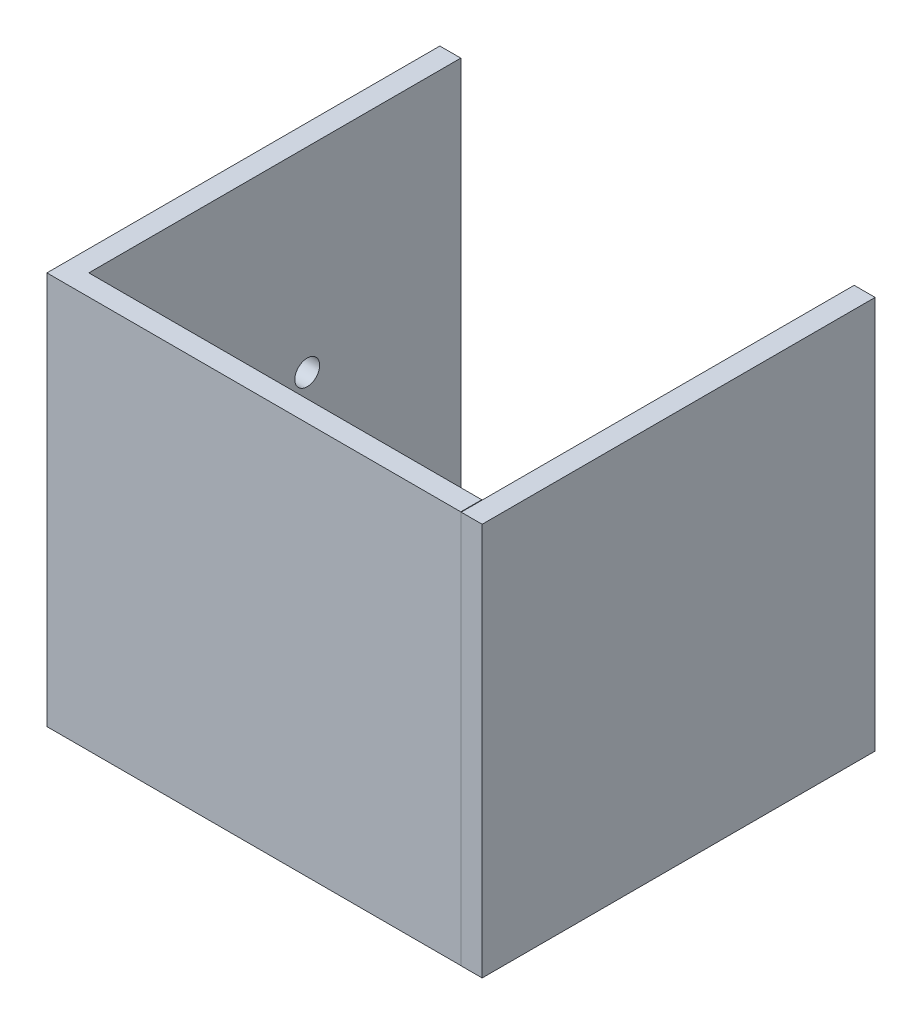
ISO-10303-21;
HEADER;
FILE_DESCRIPTION(('STEP AP214'),'2;1');
FILE_NAME('part.step','',(''),(''),'','','');
FILE_SCHEMA(('AUTOMOTIVE_DESIGN { 1 0 10303 214 1 1 1 1 }'));
ENDSEC;
DATA;
#1=APPLICATION_CONTEXT('core data for automotive mechanical design processes');
#2=APPLICATION_PROTOCOL_DEFINITION('international standard','automotive_design',2000,#1);
#3=PRODUCT_CONTEXT('',#1,'mechanical');
#4=PRODUCT('Part','Part','',(#3));
#5=PRODUCT_RELATED_PRODUCT_CATEGORY('part','',(#4));
#6=PRODUCT_DEFINITION_FORMATION('','',#4);
#7=PRODUCT_DEFINITION_CONTEXT('part definition',#1,'design');
#8=PRODUCT_DEFINITION('design','',#6,#7);
#9=PRODUCT_DEFINITION_SHAPE('','',#8);
#10=(LENGTH_UNIT() NAMED_UNIT(*) SI_UNIT(.MILLI.,.METRE.));
#11=(NAMED_UNIT(*) PLANE_ANGLE_UNIT() SI_UNIT($,.RADIAN.));
#12=(NAMED_UNIT(*) SI_UNIT($,.STERADIAN.) SOLID_ANGLE_UNIT());
#13=UNCERTAINTY_MEASURE_WITH_UNIT(LENGTH_MEASURE(1.E-05),#10,'distance_accuracy_value','');
#14=(GEOMETRIC_REPRESENTATION_CONTEXT(3) GLOBAL_UNCERTAINTY_ASSIGNED_CONTEXT((#13)) GLOBAL_UNIT_ASSIGNED_CONTEXT((#10,
#11,#12)) REPRESENTATION_CONTEXT('',''));
#15=CARTESIAN_POINT('',(0.,0.,0.));
#16=DIRECTION('',(0.,0.,1.));
#17=DIRECTION('',(1.,0.,0.));
#18=AXIS2_PLACEMENT_3D('',#15,#16,#17);
#19=CARTESIAN_POINT('',(75.,75.,8.));
#20=DIRECTION('',(-1.,0.,0.));
#21=DIRECTION('',(0.,-1.,0.));
#22=AXIS2_PLACEMENT_3D('',#19,#20,#21);
#23=PLANE('',#22);
#24=DIRECTION('',(0.,-1.,0.));
#25=VECTOR('',#24,1.);
#26=CARTESIAN_POINT('',(75.,74.8173068671335,7.85028232579545));
#27=LINE('',#26,#25);
#28=CARTESIAN_POINT('',(75.,74.8173068671335,7.85028232579545));
#29=VERTEX_POINT('',#28);
#30=CARTESIAN_POINT('',(75.,-75.,7.85028232579544));
#31=VERTEX_POINT('',#30);
#32=EDGE_CURVE('E173',#29,#31,#27,.T.);
#33=ORIENTED_EDGE('',*,*,#32,.F.);
#34=DIRECTION('',(0.,0.,1.));
#35=VECTOR('',#34,1.);
#36=CARTESIAN_POINT('',(75.,74.8173068671335,7.85028232579545));
#37=LINE('',#36,#35);
#38=CARTESIAN_POINT('',(75.,74.8173068671335,0.));
#39=VERTEX_POINT('',#38);
#40=EDGE_CURVE('E11',#39,#29,#37,.T.);
#41=ORIENTED_EDGE('',*,*,#40,.F.);
#42=DIRECTION('',(0.,1.,0.));
#43=VECTOR('',#42,1.);
#44=CARTESIAN_POINT('',(75.,75.,0.));
#45=LINE('',#44,#43);
#46=CARTESIAN_POINT('',(75.,75.,0.));
#47=VERTEX_POINT('',#46);
#48=EDGE_CURVE('E192',#39,#47,#45,.T.);
#49=ORIENTED_EDGE('',*,*,#48,.T.);
#50=DIRECTION('',(0.,0.,-1.));
#51=VECTOR('',#50,1.);
#52=CARTESIAN_POINT('',(75.,75.,8.));
#53=LINE('',#52,#51);
#54=CARTESIAN_POINT('',(75.,75.,8.));
#55=VERTEX_POINT('',#54);
#56=EDGE_CURVE('E37',#55,#47,#53,.T.);
#57=ORIENTED_EDGE('',*,*,#56,.F.);
#58=DIRECTION('',(0.,1.,0.));
#59=VECTOR('',#58,1.);
#60=CARTESIAN_POINT('',(75.,75.,8.));
#61=LINE('',#60,#59);
#62=CARTESIAN_POINT('',(75.,-75.,8.));
#63=VERTEX_POINT('',#62);
#64=EDGE_CURVE('E123',#63,#55,#61,.T.);
#65=ORIENTED_EDGE('',*,*,#64,.F.);
#66=DIRECTION('',(0.,0.,-1.));
#67=VECTOR('',#66,1.);
#68=CARTESIAN_POINT('',(75.,-75.,8.));
#69=LINE('',#68,#67);
#70=EDGE_CURVE('E204',#63,#31,#69,.T.);
#71=ORIENTED_EDGE('',*,*,#70,.T.);
#72=EDGE_LOOP('',(#33,#41,#49,#57,#65,#71));
#73=FACE_BOUND('',#72,.T.);
#74=ADVANCED_FACE('F34',(#73),#23,.F.);
#75=CARTESIAN_POINT('',(-75.,75.,8.));
#76=DIRECTION('',(0.,-1.,0.));
#77=DIRECTION('',(0.,0.,-1.));
#78=AXIS2_PLACEMENT_3D('',#75,#76,#77);
#79=PLANE('',#78);
#80=DIRECTION('',(-1.,0.,0.));
#81=VECTOR('',#80,1.);
#82=CARTESIAN_POINT('',(-75.,75.,0.));
#83=LINE('',#82,#81);
#84=CARTESIAN_POINT('',(-75.,75.,0.));
#85=VERTEX_POINT('',#84);
#86=EDGE_CURVE('E199',#47,#85,#83,.T.);
#87=ORIENTED_EDGE('',*,*,#86,.T.);
#88=DIRECTION('',(0.,0.,-1.));
#89=VECTOR('',#88,1.);
#90=CARTESIAN_POINT('',(-75.,75.,8.));
#91=LINE('',#90,#89);
#92=CARTESIAN_POINT('',(-75.,75.,-142.));
#93=VERTEX_POINT('',#92);
#94=EDGE_CURVE('E155',#85,#93,#91,.T.);
#95=ORIENTED_EDGE('',*,*,#94,.T.);
#96=DIRECTION('',(1.,0.,0.));
#97=VECTOR('',#96,1.);
#98=CARTESIAN_POINT('',(-83.,75.,-142.));
#99=LINE('',#98,#97);
#100=CARTESIAN_POINT('',(-83.,75.,-142.));
#101=VERTEX_POINT('',#100);
#102=EDGE_CURVE('E133',#101,#93,#99,.T.);
#103=ORIENTED_EDGE('',*,*,#102,.F.);
#104=DIRECTION('',(0.,0.,-1.));
#105=VECTOR('',#104,1.);
#106=CARTESIAN_POINT('',(-83.,75.,8.));
#107=LINE('',#106,#105);
#108=CARTESIAN_POINT('',(-83.,75.,8.));
#109=VERTEX_POINT('',#108);
#110=EDGE_CURVE('E130',#109,#101,#107,.T.);
#111=ORIENTED_EDGE('',*,*,#110,.F.);
#112=DIRECTION('',(-1.,0.,0.));
#113=VECTOR('',#112,1.);
#114=CARTESIAN_POINT('',(-75.,75.,8.));
#115=LINE('',#114,#113);
#116=EDGE_CURVE('E117',#55,#109,#115,.T.);
#117=ORIENTED_EDGE('',*,*,#116,.F.);
#118=ORIENTED_EDGE('',*,*,#56,.T.);
#119=EDGE_LOOP('',(#87,#95,#103,#111,#117,#118));
#120=FACE_BOUND('',#119,.T.);
#121=ADVANCED_FACE('F131',(#120),#79,.F.);
#122=CARTESIAN_POINT('',(-75.,-75.,8.));
#123=DIRECTION('',(0.,1.,0.));
#124=DIRECTION('',(0.,0.,1.));
#125=AXIS2_PLACEMENT_3D('',#122,#123,#124);
#126=PLANE('',#125);
#127=DIRECTION('',(1.,0.,0.));
#128=VECTOR('',#127,1.);
#129=CARTESIAN_POINT('',(-75.,-75.,0.));
#130=LINE('',#129,#128);
#131=CARTESIAN_POINT('',(-75.,-75.,0.));
#132=VERTEX_POINT('',#131);
#133=CARTESIAN_POINT('',(75.,-75.,0.));
#134=VERTEX_POINT('',#133);
#135=EDGE_CURVE('E193',#132,#134,#130,.T.);
#136=ORIENTED_EDGE('',*,*,#135,.T.);
#137=EDGE_CURVE('E50',#31,#134,#69,.T.);
#138=ORIENTED_EDGE('',*,*,#137,.F.);
#139=ORIENTED_EDGE('',*,*,#70,.F.);
#140=DIRECTION('',(1.,0.,0.));
#141=VECTOR('',#140,1.);
#142=CARTESIAN_POINT('',(-75.,-75.,8.));
#143=LINE('',#142,#141);
#144=CARTESIAN_POINT('',(-83.,-75.,8.00000000000002));
#145=VERTEX_POINT('',#144);
#146=EDGE_CURVE('E127',#145,#63,#143,.T.);
#147=ORIENTED_EDGE('',*,*,#146,.F.);
#148=DIRECTION('',(0.,0.,1.));
#149=VECTOR('',#148,1.);
#150=CARTESIAN_POINT('',(-83.,-75.,8.00000000000002));
#151=LINE('',#150,#149);
#152=CARTESIAN_POINT('',(-83.,-75.,-142.));
#153=VERTEX_POINT('',#152);
#154=EDGE_CURVE('E142',#153,#145,#151,.T.);
#155=ORIENTED_EDGE('',*,*,#154,.F.);
#156=DIRECTION('',(1.,0.,0.));
#157=VECTOR('',#156,1.);
#158=CARTESIAN_POINT('',(-83.,-75.,-142.));
#159=LINE('',#158,#157);
#160=CARTESIAN_POINT('',(-75.,-75.,-142.));
#161=VERTEX_POINT('',#160);
#162=EDGE_CURVE('E154',#153,#161,#159,.T.);
#163=ORIENTED_EDGE('',*,*,#162,.T.);
#164=DIRECTION('',(0.,0.,1.));
#165=VECTOR('',#164,1.);
#166=CARTESIAN_POINT('',(-75.,-75.,8.00000000000002));
#167=LINE('',#166,#165);
#168=EDGE_CURVE('E143',#161,#132,#167,.T.);
#169=ORIENTED_EDGE('',*,*,#168,.T.);
#170=EDGE_LOOP('',(#136,#138,#139,#147,#155,#163,#169));
#171=FACE_BOUND('',#170,.T.);
#172=ADVANCED_FACE('F244',(#171),#126,.F.);
#173=CARTESIAN_POINT('',(0.,0.,8.));
#174=DIRECTION('',(0.,0.,1.));
#175=DIRECTION('',(1.,0.,0.));
#176=AXIS2_PLACEMENT_3D('',#173,#174,#175);
#177=PLANE('',#176);
#178=ORIENTED_EDGE('',*,*,#64,.T.);
#179=ORIENTED_EDGE('',*,*,#116,.T.);
#180=DIRECTION('',(0.,1.,0.));
#181=VECTOR('',#180,1.);
#182=CARTESIAN_POINT('',(-83.,75.,8.));
#183=LINE('',#182,#181);
#184=EDGE_CURVE('E121',#145,#109,#183,.T.);
#185=ORIENTED_EDGE('',*,*,#184,.F.);
#186=ORIENTED_EDGE('',*,*,#146,.T.);
#187=EDGE_LOOP('',(#178,#179,#185,#186));
#188=FACE_BOUND('',#187,.T.);
#189=ADVANCED_FACE('F119',(#188),#177,.T.);
#190=CARTESIAN_POINT('',(0.,0.,0.));
#191=DIRECTION('',(0.,0.,1.));
#192=DIRECTION('',(1.,0.,0.));
#193=AXIS2_PLACEMENT_3D('',#190,#191,#192);
#194=PLANE('',#193);
#195=EDGE_CURVE('E196',#134,#39,#45,.T.);
#196=ORIENTED_EDGE('',*,*,#195,.F.);
#197=ORIENTED_EDGE('',*,*,#135,.F.);
#198=DIRECTION('',(0.,-1.,0.));
#199=VECTOR('',#198,1.);
#200=CARTESIAN_POINT('',(-75.,75.,0.));
#201=LINE('',#200,#199);
#202=EDGE_CURVE('E201',#85,#132,#201,.T.);
#203=ORIENTED_EDGE('',*,*,#202,.F.);
#204=ORIENTED_EDGE('',*,*,#86,.F.);
#205=ORIENTED_EDGE('',*,*,#48,.F.);
#206=EDGE_LOOP('',(#196,#197,#203,#204,#205));
#207=FACE_BOUND('',#206,.T.);
#208=ADVANCED_FACE('F250',(#207),#194,.F.);
#209=CARTESIAN_POINT('',(75.,0.,0.));
#210=DIRECTION('',(1.,0.,0.));
#211=DIRECTION('',(0.,1.,0.));
#212=AXIS2_PLACEMENT_3D('',#209,#210,#211);
#213=PLANE('',#212);
#214=ORIENTED_EDGE('',*,*,#137,.T.);
#215=ORIENTED_EDGE('',*,*,#195,.T.);
#216=CARTESIAN_POINT('',(75.,74.8173068671335,-142.149717674205));
#217=VERTEX_POINT('',#216);
#218=EDGE_CURVE('E43',#217,#39,#37,.T.);
#219=ORIENTED_EDGE('',*,*,#218,.F.);
#220=DIRECTION('',(0.,1.,0.));
#221=VECTOR('',#220,1.);
#222=CARTESIAN_POINT('',(75.,74.8173068671335,-142.149717674205));
#223=LINE('',#222,#221);
#224=CARTESIAN_POINT('',(75.,-75.1826931328665,-142.149717674205));
#225=VERTEX_POINT('',#224);
#226=EDGE_CURVE('E178',#225,#217,#223,.T.);
#227=ORIENTED_EDGE('',*,*,#226,.F.);
#228=DIRECTION('',(0.,0.,-1.));
#229=VECTOR('',#228,1.);
#230=CARTESIAN_POINT('',(75.,-75.1826931328665,7.85028232579543));
#231=LINE('',#230,#229);
#232=CARTESIAN_POINT('',(75.,-75.1826931328665,7.85028232579543));
#233=VERTEX_POINT('',#232);
#234=EDGE_CURVE('E176',#233,#225,#231,.T.);
#235=ORIENTED_EDGE('',*,*,#234,.F.);
#236=EDGE_CURVE('E162',#31,#233,#27,.T.);
#237=ORIENTED_EDGE('',*,*,#236,.F.);
#238=EDGE_LOOP('',(#214,#215,#219,#227,#235,#237));
#239=FACE_BOUND('',#238,.T.);
#240=ADVANCED_FACE('F207',(#239),#213,.F.);
#241=CARTESIAN_POINT('',(83.,74.8173068671335,7.85028232579545));
#242=DIRECTION('',(0.,0.,-1.));
#243=DIRECTION('',(0.,1.,0.));
#244=AXIS2_PLACEMENT_3D('',#241,#242,#243);
#245=PLANE('',#244);
#246=ORIENTED_EDGE('',*,*,#32,.T.);
#247=ORIENTED_EDGE('',*,*,#236,.T.);
#248=DIRECTION('',(-1.,0.,0.));
#249=VECTOR('',#248,1.);
#250=CARTESIAN_POINT('',(83.,-75.1826931328665,7.85028232579543));
#251=LINE('',#250,#249);
#252=CARTESIAN_POINT('',(83.,-75.1826931328665,7.85028232579543));
#253=VERTEX_POINT('',#252);
#254=EDGE_CURVE('E189',#253,#233,#251,.T.);
#255=ORIENTED_EDGE('',*,*,#254,.F.);
#256=DIRECTION('',(0.,-1.,0.));
#257=VECTOR('',#256,1.);
#258=CARTESIAN_POINT('',(83.,74.8173068671335,7.85028232579545));
#259=LINE('',#258,#257);
#260=CARTESIAN_POINT('',(83.,74.8173068671335,7.85028232579545));
#261=VERTEX_POINT('',#260);
#262=EDGE_CURVE('E163',#261,#253,#259,.T.);
#263=ORIENTED_EDGE('',*,*,#262,.F.);
#264=DIRECTION('',(-1.,0.,0.));
#265=VECTOR('',#264,1.);
#266=CARTESIAN_POINT('',(83.,74.8173068671335,7.85028232579545));
#267=LINE('',#266,#265);
#268=EDGE_CURVE('E172',#261,#29,#267,.T.);
#269=ORIENTED_EDGE('',*,*,#268,.T.);
#270=EDGE_LOOP('',(#246,#247,#255,#263,#269));
#271=FACE_BOUND('',#270,.T.);
#272=ADVANCED_FACE('F214',(#271),#245,.F.);
#273=CARTESIAN_POINT('',(83.,-75.1826931328665,7.85028232579543));
#274=DIRECTION('',(0.,1.,0.));
#275=DIRECTION('',(-1.,0.,0.));
#276=AXIS2_PLACEMENT_3D('',#273,#274,#275);
#277=PLANE('',#276);
#278=ORIENTED_EDGE('',*,*,#234,.T.);
#279=DIRECTION('',(-1.,0.,0.));
#280=VECTOR('',#279,1.);
#281=CARTESIAN_POINT('',(83.,-75.1826931328665,-142.149717674205));
#282=LINE('',#281,#280);
#283=CARTESIAN_POINT('',(83.,-75.1826931328665,-142.149717674205));
#284=VERTEX_POINT('',#283);
#285=EDGE_CURVE('E186',#284,#225,#282,.T.);
#286=ORIENTED_EDGE('',*,*,#285,.F.);
#287=DIRECTION('',(0.,0.,-1.));
#288=VECTOR('',#287,1.);
#289=CARTESIAN_POINT('',(83.,-75.1826931328665,7.85028232579543));
#290=LINE('',#289,#288);
#291=EDGE_CURVE('E166',#253,#284,#290,.T.);
#292=ORIENTED_EDGE('',*,*,#291,.F.);
#293=ORIENTED_EDGE('',*,*,#254,.T.);
#294=EDGE_LOOP('',(#278,#286,#292,#293));
#295=FACE_BOUND('',#294,.T.);
#296=ADVANCED_FACE('F226',(#295),#277,.F.);
#297=CARTESIAN_POINT('',(83.,74.8173068671335,-142.149717674205));
#298=DIRECTION('',(0.,0.,1.));
#299=DIRECTION('',(0.,-1.,0.));
#300=AXIS2_PLACEMENT_3D('',#297,#298,#299);
#301=PLANE('',#300);
#302=ORIENTED_EDGE('',*,*,#226,.T.);
#303=DIRECTION('',(-1.,0.,0.));
#304=VECTOR('',#303,1.);
#305=CARTESIAN_POINT('',(83.,74.8173068671335,-142.149717674205));
#306=LINE('',#305,#304);
#307=CARTESIAN_POINT('',(83.,74.8173068671335,-142.149717674205));
#308=VERTEX_POINT('',#307);
#309=EDGE_CURVE('E183',#308,#217,#306,.T.);
#310=ORIENTED_EDGE('',*,*,#309,.F.);
#311=DIRECTION('',(0.,1.,0.));
#312=VECTOR('',#311,1.);
#313=CARTESIAN_POINT('',(83.,74.8173068671335,-142.149717674205));
#314=LINE('',#313,#312);
#315=EDGE_CURVE('E168',#284,#308,#314,.T.);
#316=ORIENTED_EDGE('',*,*,#315,.F.);
#317=ORIENTED_EDGE('',*,*,#285,.T.);
#318=EDGE_LOOP('',(#302,#310,#316,#317));
#319=FACE_BOUND('',#318,.T.);
#320=ADVANCED_FACE('F222',(#319),#301,.F.);
#321=CARTESIAN_POINT('',(83.,74.8173068671335,7.85028232579545));
#322=DIRECTION('',(0.,-1.,0.));
#323=DIRECTION('',(1.,0.,0.));
#324=AXIS2_PLACEMENT_3D('',#321,#322,#323);
#325=PLANE('',#324);
#326=ORIENTED_EDGE('',*,*,#218,.T.);
#327=ORIENTED_EDGE('',*,*,#40,.T.);
#328=ORIENTED_EDGE('',*,*,#268,.F.);
#329=DIRECTION('',(0.,0.,1.));
#330=VECTOR('',#329,1.);
#331=CARTESIAN_POINT('',(83.,74.8173068671335,7.85028232579545));
#332=LINE('',#331,#330);
#333=EDGE_CURVE('E170',#308,#261,#332,.T.);
#334=ORIENTED_EDGE('',*,*,#333,.F.);
#335=ORIENTED_EDGE('',*,*,#309,.T.);
#336=EDGE_LOOP('',(#326,#327,#328,#334,#335));
#337=FACE_BOUND('',#336,.T.);
#338=ADVANCED_FACE('F218',(#337),#325,.F.);
#339=CARTESIAN_POINT('',(83.,0.,0.));
#340=DIRECTION('',(1.,0.,0.));
#341=DIRECTION('',(0.,1.,0.));
#342=AXIS2_PLACEMENT_3D('',#339,#340,#341);
#343=PLANE('',#342);
#344=ORIENTED_EDGE('',*,*,#262,.T.);
#345=ORIENTED_EDGE('',*,*,#291,.T.);
#346=ORIENTED_EDGE('',*,*,#315,.T.);
#347=ORIENTED_EDGE('',*,*,#333,.T.);
#348=EDGE_LOOP('',(#344,#345,#346,#347));
#349=FACE_BOUND('',#348,.T.);
#350=ADVANCED_FACE('F228',(#349),#343,.T.);
#351=CARTESIAN_POINT('',(-83.,0.,0.));
#352=DIRECTION('',(1.,0.,0.));
#353=DIRECTION('',(0.,1.,0.));
#354=AXIS2_PLACEMENT_3D('',#351,#352,#353);
#355=PLANE('',#354);
#356=ORIENTED_EDGE('',*,*,#184,.T.);
#357=ORIENTED_EDGE('',*,*,#110,.T.);
#358=DIRECTION('',(0.,-1.,0.));
#359=VECTOR('',#358,1.);
#360=CARTESIAN_POINT('',(-83.,75.,-142.));
#361=LINE('',#360,#359);
#362=EDGE_CURVE('E136',#101,#153,#361,.T.);
#363=ORIENTED_EDGE('',*,*,#362,.T.);
#364=ORIENTED_EDGE('',*,*,#154,.T.);
#365=EDGE_LOOP('',(#356,#357,#363,#364));
#366=FACE_BOUND('',#365,.T.);
#367=CARTESIAN_POINT('',(-83.,0.42022931205698,-83.3821840191696));
#368=DIRECTION('',(-1.,0.,0.));
#369=DIRECTION('',(0.,-1.,0.));
#370=AXIS2_PLACEMENT_3D('',#367,#368,#369);
#371=CIRCLE('',#370,4.74319273444996);
#372=CARTESIAN_POINT('',(-83.,-4.32296342239298,-83.3821840191696));
#373=VERTEX_POINT('',#372);
#374=EDGE_CURVE('E157',#373,#373,#371,.T.);
#375=ORIENTED_EDGE('',*,*,#374,.F.);
#376=EDGE_LOOP('',(#375));
#377=FACE_BOUND('',#376,.T.);
#378=ADVANCED_FACE('F139',(#366,#377),#355,.F.);
#379=CARTESIAN_POINT('',(-75.,0.,0.));
#380=DIRECTION('',(1.,0.,0.));
#381=DIRECTION('',(0.,1.,0.));
#382=AXIS2_PLACEMENT_3D('',#379,#380,#381);
#383=PLANE('',#382);
#384=ORIENTED_EDGE('',*,*,#94,.F.);
#385=ORIENTED_EDGE('',*,*,#202,.T.);
#386=ORIENTED_EDGE('',*,*,#168,.F.);
#387=DIRECTION('',(0.,-1.,0.));
#388=VECTOR('',#387,1.);
#389=CARTESIAN_POINT('',(-75.,75.,-142.));
#390=LINE('',#389,#388);
#391=EDGE_CURVE('E146',#93,#161,#390,.T.);
#392=ORIENTED_EDGE('',*,*,#391,.F.);
#393=EDGE_LOOP('',(#384,#385,#386,#392));
#394=FACE_BOUND('',#393,.T.);
#395=CARTESIAN_POINT('',(-75.,0.420229312056981,-83.3821840191696));
#396=DIRECTION('',(-1.,0.,0.));
#397=DIRECTION('',(0.,-1.,0.));
#398=AXIS2_PLACEMENT_3D('',#395,#396,#397);
#399=CIRCLE('',#398,4.74319273444996);
#400=CARTESIAN_POINT('',(-75.,-4.32296342239298,-83.3821840191696));
#401=VERTEX_POINT('',#400);
#402=EDGE_CURVE('E149',#401,#401,#399,.T.);
#403=ORIENTED_EDGE('',*,*,#402,.T.);
#404=EDGE_LOOP('',(#403));
#405=FACE_BOUND('',#404,.T.);
#406=ADVANCED_FACE('F235',(#394,#405),#383,.T.);
#407=CARTESIAN_POINT('',(-83.,75.,-142.));
#408=DIRECTION('',(0.,0.,1.));
#409=DIRECTION('',(0.,-1.,0.));
#410=AXIS2_PLACEMENT_3D('',#407,#408,#409);
#411=PLANE('',#410);
#412=ORIENTED_EDGE('',*,*,#391,.T.);
#413=ORIENTED_EDGE('',*,*,#162,.F.);
#414=ORIENTED_EDGE('',*,*,#362,.F.);
#415=ORIENTED_EDGE('',*,*,#102,.T.);
#416=EDGE_LOOP('',(#412,#413,#414,#415));
#417=FACE_BOUND('',#416,.T.);
#418=ADVANCED_FACE('F325',(#417),#411,.F.);
#419=CARTESIAN_POINT('',(-83.,0.42022931205698,-83.3821840191696));
#420=DIRECTION('',(1.,0.,0.));
#421=DIRECTION('',(0.,1.,0.));
#422=AXIS2_PLACEMENT_3D('',#419,#420,#421);
#423=CYLINDRICAL_SURFACE('',#422,4.74319273444996);
#424=ORIENTED_EDGE('',*,*,#374,.T.);
#425=EDGE_LOOP('',(#424));
#426=FACE_BOUND('',#425,.T.);
#427=ORIENTED_EDGE('',*,*,#402,.F.);
#428=EDGE_LOOP('',(#427));
#429=FACE_BOUND('',#428,.T.);
#430=ADVANCED_FACE('F335',(#426,#429),#423,.F.);
#431=CLOSED_SHELL('',(#74,#121,#172,#189,#208,#240,#272,#296,#320,#338,#350,#378,#406,#418,#430));
#432=MANIFOLD_SOLID_BREP('B2',#431);
#433=ADVANCED_BREP_SHAPE_REPRESENTATION('',(#18,#432),#14);
#434=SHAPE_DEFINITION_REPRESENTATION(#9,#433);
ENDSEC;
END-ISO-10303-21;
